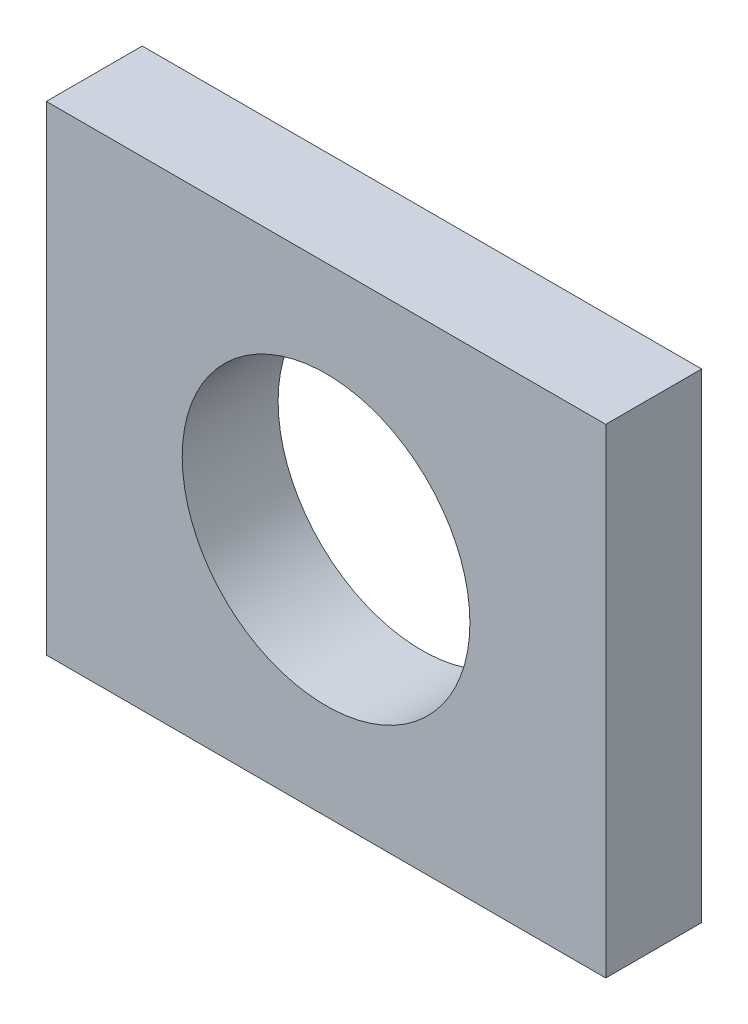
ISO-10303-21;
HEADER;
FILE_DESCRIPTION(('STEP AP214'),'2;1');
FILE_NAME('part.step','',(''),(''),'','','');
FILE_SCHEMA(('AUTOMOTIVE_DESIGN { 1 0 10303 214 1 1 1 1 }'));
ENDSEC;
DATA;
#1=APPLICATION_CONTEXT('core data for automotive mechanical design processes');
#2=APPLICATION_PROTOCOL_DEFINITION('international standard','automotive_design',2000,#1);
#3=PRODUCT_CONTEXT('',#1,'mechanical');
#4=PRODUCT('Part','Part','',(#3));
#5=PRODUCT_RELATED_PRODUCT_CATEGORY('part','',(#4));
#6=PRODUCT_DEFINITION_FORMATION('','',#4);
#7=PRODUCT_DEFINITION_CONTEXT('part definition',#1,'design');
#8=PRODUCT_DEFINITION('design','',#6,#7);
#9=PRODUCT_DEFINITION_SHAPE('','',#8);
#10=(LENGTH_UNIT() NAMED_UNIT(*) SI_UNIT(.MILLI.,.METRE.));
#11=(NAMED_UNIT(*) PLANE_ANGLE_UNIT() SI_UNIT($,.RADIAN.));
#12=(NAMED_UNIT(*) SI_UNIT($,.STERADIAN.) SOLID_ANGLE_UNIT());
#13=UNCERTAINTY_MEASURE_WITH_UNIT(LENGTH_MEASURE(1.E-05),#10,'distance_accuracy_value','');
#14=(GEOMETRIC_REPRESENTATION_CONTEXT(3) GLOBAL_UNCERTAINTY_ASSIGNED_CONTEXT((#13)) GLOBAL_UNIT_ASSIGNED_CONTEXT((#10,
#11,#12)) REPRESENTATION_CONTEXT('',''));
#15=CARTESIAN_POINT('',(0.,0.,0.));
#16=DIRECTION('',(0.,0.,1.));
#17=DIRECTION('',(1.,0.,0.));
#18=AXIS2_PLACEMENT_3D('',#15,#16,#17);
#19=CARTESIAN_POINT('',(35.,-30.,12.));
#20=DIRECTION('',(-1.,0.,0.));
#21=DIRECTION('',(0.,0.,1.));
#22=AXIS2_PLACEMENT_3D('',#19,#20,#21);
#23=PLANE('',#22);
#24=DIRECTION('',(0.,1.,0.));
#25=VECTOR('',#24,1.);
#26=CARTESIAN_POINT('',(35.,-30.,0.));
#27=LINE('',#26,#25);
#28=CARTESIAN_POINT('',(35.,-30.,0.));
#29=VERTEX_POINT('',#28);
#30=CARTESIAN_POINT('',(35.,30.,0.));
#31=VERTEX_POINT('',#30);
#32=EDGE_CURVE('E100',#29,#31,#27,.T.);
#33=ORIENTED_EDGE('',*,*,#32,.T.);
#34=DIRECTION('',(0.,0.,-1.));
#35=VECTOR('',#34,1.);
#36=CARTESIAN_POINT('',(35.,30.,12.));
#37=LINE('',#36,#35);
#38=CARTESIAN_POINT('',(35.,30.,12.));
#39=VERTEX_POINT('',#38);
#40=EDGE_CURVE('E11',#39,#31,#37,.T.);
#41=ORIENTED_EDGE('',*,*,#40,.F.);
#42=DIRECTION('',(0.,1.,0.));
#43=VECTOR('',#42,1.);
#44=CARTESIAN_POINT('',(35.,-30.,12.));
#45=LINE('',#44,#43);
#46=CARTESIAN_POINT('',(35.,-30.,12.));
#47=VERTEX_POINT('',#46);
#48=EDGE_CURVE('E88',#47,#39,#45,.T.);
#49=ORIENTED_EDGE('',*,*,#48,.F.);
#50=DIRECTION('',(0.,0.,-1.));
#51=VECTOR('',#50,1.);
#52=CARTESIAN_POINT('',(35.,-30.,12.));
#53=LINE('',#52,#51);
#54=EDGE_CURVE('E96',#47,#29,#53,.T.);
#55=ORIENTED_EDGE('',*,*,#54,.T.);
#56=EDGE_LOOP('',(#33,#41,#49,#55));
#57=FACE_BOUND('',#56,.T.);
#58=ADVANCED_FACE('F37',(#57),#23,.F.);
#59=CARTESIAN_POINT('',(-35.,30.,12.));
#60=DIRECTION('',(0.,-1.,0.));
#61=DIRECTION('',(1.,0.,0.));
#62=AXIS2_PLACEMENT_3D('',#59,#60,#61);
#63=PLANE('',#62);
#64=DIRECTION('',(-1.,0.,0.));
#65=VECTOR('',#64,1.);
#66=CARTESIAN_POINT('',(-35.,30.,0.));
#67=LINE('',#66,#65);
#68=CARTESIAN_POINT('',(-35.,30.,0.));
#69=VERTEX_POINT('',#68);
#70=EDGE_CURVE('E92',#31,#69,#67,.T.);
#71=ORIENTED_EDGE('',*,*,#70,.T.);
#72=DIRECTION('',(0.,0.,-1.));
#73=VECTOR('',#72,1.);
#74=CARTESIAN_POINT('',(-35.,30.,12.));
#75=LINE('',#74,#73);
#76=CARTESIAN_POINT('',(-35.,30.,12.));
#77=VERTEX_POINT('',#76);
#78=EDGE_CURVE('E45',#77,#69,#75,.T.);
#79=ORIENTED_EDGE('',*,*,#78,.F.);
#80=DIRECTION('',(-1.,0.,0.));
#81=VECTOR('',#80,1.);
#82=CARTESIAN_POINT('',(-35.,30.,12.));
#83=LINE('',#82,#81);
#84=EDGE_CURVE('E83',#39,#77,#83,.T.);
#85=ORIENTED_EDGE('',*,*,#84,.F.);
#86=ORIENTED_EDGE('',*,*,#40,.T.);
#87=EDGE_LOOP('',(#71,#79,#85,#86));
#88=FACE_BOUND('',#87,.T.);
#89=ADVANCED_FACE('F91',(#88),#63,.F.);
#90=CARTESIAN_POINT('',(-35.,-30.,12.));
#91=DIRECTION('',(1.,0.,0.));
#92=DIRECTION('',(0.,0.,-1.));
#93=AXIS2_PLACEMENT_3D('',#90,#91,#92);
#94=PLANE('',#93);
#95=DIRECTION('',(0.,-1.,0.));
#96=VECTOR('',#95,1.);
#97=CARTESIAN_POINT('',(-35.,-30.,0.));
#98=LINE('',#97,#96);
#99=CARTESIAN_POINT('',(-35.,-30.,0.));
#100=VERTEX_POINT('',#99);
#101=EDGE_CURVE('E70',#69,#100,#98,.T.);
#102=ORIENTED_EDGE('',*,*,#101,.T.);
#103=DIRECTION('',(0.,0.,-1.));
#104=VECTOR('',#103,1.);
#105=CARTESIAN_POINT('',(-35.,-30.,12.));
#106=LINE('',#105,#104);
#107=CARTESIAN_POINT('',(-35.,-30.,12.));
#108=VERTEX_POINT('',#107);
#109=EDGE_CURVE('E93',#108,#100,#106,.T.);
#110=ORIENTED_EDGE('',*,*,#109,.F.);
#111=DIRECTION('',(0.,-1.,0.));
#112=VECTOR('',#111,1.);
#113=CARTESIAN_POINT('',(-35.,-30.,12.));
#114=LINE('',#113,#112);
#115=EDGE_CURVE('E86',#77,#108,#114,.T.);
#116=ORIENTED_EDGE('',*,*,#115,.F.);
#117=ORIENTED_EDGE('',*,*,#78,.T.);
#118=EDGE_LOOP('',(#102,#110,#116,#117));
#119=FACE_BOUND('',#118,.T.);
#120=ADVANCED_FACE('F94',(#119),#94,.F.);
#121=CARTESIAN_POINT('',(-35.,-30.,12.));
#122=DIRECTION('',(0.,1.,0.));
#123=DIRECTION('',(-1.,0.,0.));
#124=AXIS2_PLACEMENT_3D('',#121,#122,#123);
#125=PLANE('',#124);
#126=DIRECTION('',(1.,0.,0.));
#127=VECTOR('',#126,1.);
#128=CARTESIAN_POINT('',(-35.,-30.,0.));
#129=LINE('',#128,#127);
#130=EDGE_CURVE('E76',#100,#29,#129,.T.);
#131=ORIENTED_EDGE('',*,*,#130,.T.);
#132=ORIENTED_EDGE('',*,*,#54,.F.);
#133=DIRECTION('',(1.,0.,0.));
#134=VECTOR('',#133,1.);
#135=CARTESIAN_POINT('',(-35.,-30.,12.));
#136=LINE('',#135,#134);
#137=EDGE_CURVE('E53',#108,#47,#136,.T.);
#138=ORIENTED_EDGE('',*,*,#137,.F.);
#139=ORIENTED_EDGE('',*,*,#109,.T.);
#140=EDGE_LOOP('',(#131,#132,#138,#139));
#141=FACE_BOUND('',#140,.T.);
#142=ADVANCED_FACE('F108',(#141),#125,.F.);
#143=CARTESIAN_POINT('',(0.,0.,12.));
#144=DIRECTION('',(0.,0.,-1.));
#145=DIRECTION('',(-1.,0.,0.));
#146=AXIS2_PLACEMENT_3D('',#143,#144,#145);
#147=PLANE('',#146);
#148=CARTESIAN_POINT('',(3.88578058618805E-13,0.,12.));
#149=DIRECTION('',(0.,0.,-1.));
#150=DIRECTION('',(-1.,0.,0.));
#151=AXIS2_PLACEMENT_3D('',#148,#149,#150);
#152=CIRCLE('',#151,18.);
#153=CARTESIAN_POINT('',(-17.9999999999996,0.,12.));
#154=VERTEX_POINT('',#153);
#155=EDGE_CURVE('E103',#154,#154,#152,.F.);
#156=ORIENTED_EDGE('',*,*,#155,.F.);
#157=EDGE_LOOP('',(#156));
#158=FACE_BOUND('',#157,.T.);
#159=ORIENTED_EDGE('',*,*,#48,.T.);
#160=ORIENTED_EDGE('',*,*,#84,.T.);
#161=ORIENTED_EDGE('',*,*,#115,.T.);
#162=ORIENTED_EDGE('',*,*,#137,.T.);
#163=EDGE_LOOP('',(#159,#160,#161,#162));
#164=FACE_BOUND('',#163,.T.);
#165=ADVANCED_FACE('F84',(#158,#164),#147,.F.);
#166=CARTESIAN_POINT('',(0.,0.,0.));
#167=DIRECTION('',(0.,0.,-1.));
#168=DIRECTION('',(-1.,0.,0.));
#169=AXIS2_PLACEMENT_3D('',#166,#167,#168);
#170=PLANE('',#169);
#171=CARTESIAN_POINT('',(3.88578058618805E-13,0.,0.));
#172=DIRECTION('',(0.,0.,-1.));
#173=DIRECTION('',(-1.,0.,0.));
#174=AXIS2_PLACEMENT_3D('',#171,#172,#173);
#175=CIRCLE('',#174,18.);
#176=CARTESIAN_POINT('',(-17.9999999999996,0.,0.));
#177=VERTEX_POINT('',#176);
#178=EDGE_CURVE('E116',#177,#177,#175,.T.);
#179=ORIENTED_EDGE('',*,*,#178,.F.);
#180=EDGE_LOOP('',(#179));
#181=FACE_BOUND('',#180,.T.);
#182=ORIENTED_EDGE('',*,*,#32,.F.);
#183=ORIENTED_EDGE('',*,*,#130,.F.);
#184=ORIENTED_EDGE('',*,*,#101,.F.);
#185=ORIENTED_EDGE('',*,*,#70,.F.);
#186=EDGE_LOOP('',(#182,#183,#184,#185));
#187=FACE_BOUND('',#186,.T.);
#188=ADVANCED_FACE('F111',(#181,#187),#170,.T.);
#189=CARTESIAN_POINT('',(3.88578058618805E-13,0.,12.001));
#190=DIRECTION('',(0.,0.,-1.));
#191=DIRECTION('',(-1.,0.,0.));
#192=AXIS2_PLACEMENT_3D('',#189,#190,#191);
#193=CYLINDRICAL_SURFACE('',#192,18.);
#194=ORIENTED_EDGE('',*,*,#178,.T.);
#195=EDGE_LOOP('',(#194));
#196=FACE_BOUND('',#195,.T.);
#197=ORIENTED_EDGE('',*,*,#155,.T.);
#198=EDGE_LOOP('',(#197));
#199=FACE_BOUND('',#198,.T.);
#200=ADVANCED_FACE('F120',(#196,#199),#193,.F.);
#201=CLOSED_SHELL('',(#58,#89,#120,#142,#165,#188,#200));
#202=MANIFOLD_SOLID_BREP('B2',#201);
#203=ADVANCED_BREP_SHAPE_REPRESENTATION('',(#18,#202),#14);
#204=SHAPE_DEFINITION_REPRESENTATION(#9,#203);
ENDSEC;
END-ISO-10303-21;
